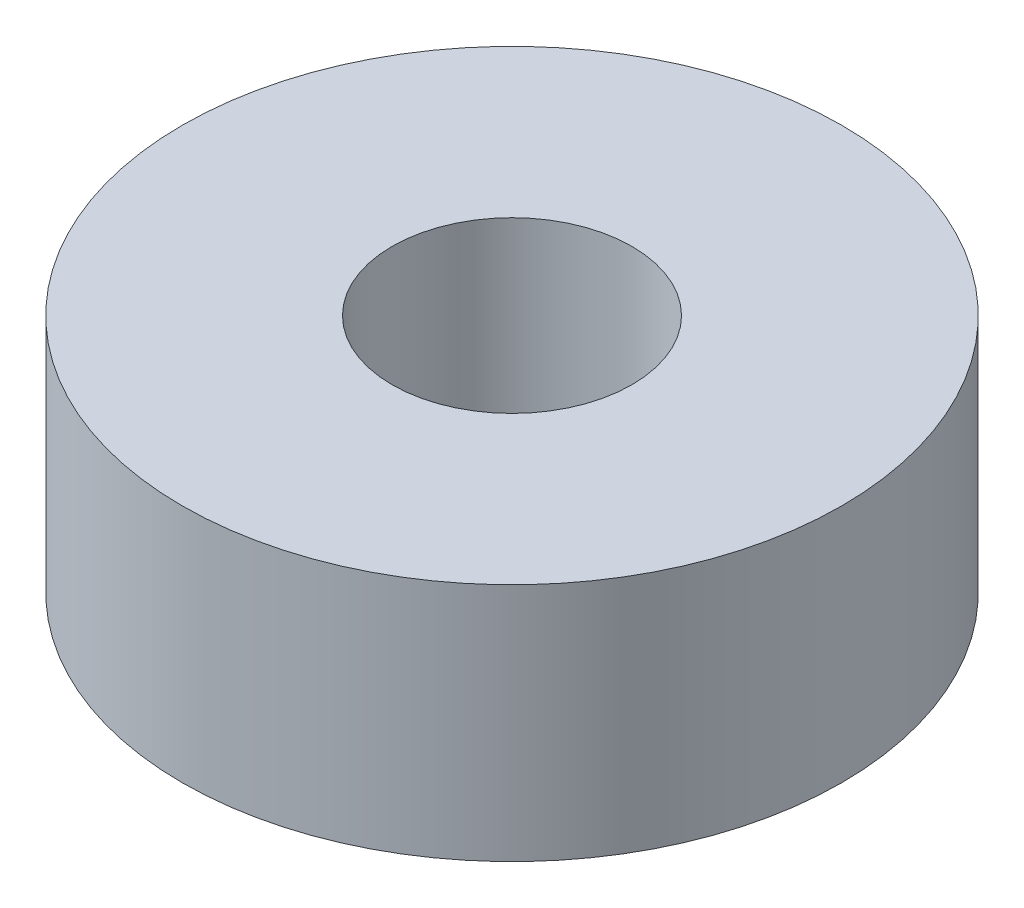
ISO-10303-21;
HEADER;
FILE_DESCRIPTION(('STEP AP214'),'2;1');
FILE_NAME('part.step','',(''),(''),'','','');
FILE_SCHEMA(('AUTOMOTIVE_DESIGN { 1 0 10303 214 1 1 1 1 }'));
ENDSEC;
DATA;
#1=APPLICATION_CONTEXT('core data for automotive mechanical design processes');
#2=APPLICATION_PROTOCOL_DEFINITION('international standard','automotive_design',2000,#1);
#3=PRODUCT_CONTEXT('',#1,'mechanical');
#4=PRODUCT('Part','Part','',(#3));
#5=PRODUCT_RELATED_PRODUCT_CATEGORY('part','',(#4));
#6=PRODUCT_DEFINITION_FORMATION('','',#4);
#7=PRODUCT_DEFINITION_CONTEXT('part definition',#1,'design');
#8=PRODUCT_DEFINITION('design','',#6,#7);
#9=PRODUCT_DEFINITION_SHAPE('','',#8);
#10=(LENGTH_UNIT() NAMED_UNIT(*) SI_UNIT(.MILLI.,.METRE.));
#11=(NAMED_UNIT(*) PLANE_ANGLE_UNIT() SI_UNIT($,.RADIAN.));
#12=(NAMED_UNIT(*) SI_UNIT($,.STERADIAN.) SOLID_ANGLE_UNIT());
#13=UNCERTAINTY_MEASURE_WITH_UNIT(LENGTH_MEASURE(1.E-05),#10,'distance_accuracy_value','');
#14=(GEOMETRIC_REPRESENTATION_CONTEXT(3) GLOBAL_UNCERTAINTY_ASSIGNED_CONTEXT((#13)) GLOBAL_UNIT_ASSIGNED_CONTEXT((#10,
#11,#12)) REPRESENTATION_CONTEXT('',''));
#15=CARTESIAN_POINT('',(0.,0.,0.));
#16=DIRECTION('',(0.,0.,1.));
#17=DIRECTION('',(1.,0.,0.));
#18=AXIS2_PLACEMENT_3D('',#15,#16,#17);
#19=CARTESIAN_POINT('',(0.,8.,0.));
#20=DIRECTION('',(0.,1.,0.));
#21=DIRECTION('',(0.,0.,1.));
#22=AXIS2_PLACEMENT_3D('',#19,#20,#21);
#23=PLANE('',#22);
#24=CARTESIAN_POINT('',(0.,8.,0.));
#25=DIRECTION('',(0.,1.,0.));
#26=DIRECTION('',(0.,0.,1.));
#27=AXIS2_PLACEMENT_3D('',#24,#25,#26);
#28=CIRCLE('',#27,11.);
#29=CARTESIAN_POINT('',(0.,8.,11.));
#30=VERTEX_POINT('',#29);
#31=EDGE_CURVE('E10',#30,#30,#28,.T.);
#32=ORIENTED_EDGE('',*,*,#31,.T.);
#33=EDGE_LOOP('',(#32));
#34=FACE_BOUND('',#33,.T.);
#35=CARTESIAN_POINT('',(0.,8.,0.));
#36=DIRECTION('',(0.,1.,0.));
#37=DIRECTION('',(0.,0.,1.));
#38=AXIS2_PLACEMENT_3D('',#35,#36,#37);
#39=CIRCLE('',#38,4.);
#40=CARTESIAN_POINT('',(0.,8.,4.));
#41=VERTEX_POINT('',#40);
#42=EDGE_CURVE('E43',#41,#41,#39,.T.);
#43=ORIENTED_EDGE('',*,*,#42,.F.);
#44=EDGE_LOOP('',(#43));
#45=FACE_BOUND('',#44,.T.);
#46=ADVANCED_FACE('F32',(#34,#45),#23,.T.);
#47=CARTESIAN_POINT('',(0.,0.,0.));
#48=DIRECTION('',(0.,1.,0.));
#49=DIRECTION('',(0.,0.,1.));
#50=AXIS2_PLACEMENT_3D('',#47,#48,#49);
#51=PLANE('',#50);
#52=CARTESIAN_POINT('',(0.,0.,0.));
#53=DIRECTION('',(0.,1.,0.));
#54=DIRECTION('',(0.,0.,1.));
#55=AXIS2_PLACEMENT_3D('',#52,#53,#54);
#56=CIRCLE('',#55,11.);
#57=CARTESIAN_POINT('',(0.,0.,11.));
#58=VERTEX_POINT('',#57);
#59=EDGE_CURVE('E36',#58,#58,#56,.T.);
#60=ORIENTED_EDGE('',*,*,#59,.F.);
#61=EDGE_LOOP('',(#60));
#62=FACE_BOUND('',#61,.T.);
#63=CARTESIAN_POINT('',(0.,0.,0.));
#64=DIRECTION('',(0.,1.,0.));
#65=DIRECTION('',(0.,0.,1.));
#66=AXIS2_PLACEMENT_3D('',#63,#64,#65);
#67=CIRCLE('',#66,4.);
#68=CARTESIAN_POINT('',(0.,0.,4.));
#69=VERTEX_POINT('',#68);
#70=EDGE_CURVE('E45',#69,#69,#67,.T.);
#71=ORIENTED_EDGE('',*,*,#70,.T.);
#72=EDGE_LOOP('',(#71));
#73=FACE_BOUND('',#72,.T.);
#74=ADVANCED_FACE('F55',(#62,#73),#51,.F.);
#75=CARTESIAN_POINT('',(0.,8.,0.));
#76=DIRECTION('',(0.,-1.,0.));
#77=DIRECTION('',(0.,0.,-1.));
#78=AXIS2_PLACEMENT_3D('',#75,#76,#77);
#79=CYLINDRICAL_SURFACE('',#78,11.);
#80=ORIENTED_EDGE('',*,*,#31,.F.);
#81=EDGE_LOOP('',(#80));
#82=FACE_BOUND('',#81,.T.);
#83=ORIENTED_EDGE('',*,*,#59,.T.);
#84=EDGE_LOOP('',(#83));
#85=FACE_BOUND('',#84,.T.);
#86=ADVANCED_FACE('F34',(#82,#85),#79,.T.);
#87=CARTESIAN_POINT('',(0.,8.,0.));
#88=DIRECTION('',(0.,-1.,0.));
#89=DIRECTION('',(0.,0.,-1.));
#90=AXIS2_PLACEMENT_3D('',#87,#88,#89);
#91=CYLINDRICAL_SURFACE('',#90,4.);
#92=ORIENTED_EDGE('',*,*,#42,.T.);
#93=EDGE_LOOP('',(#92));
#94=FACE_BOUND('',#93,.T.);
#95=ORIENTED_EDGE('',*,*,#70,.F.);
#96=EDGE_LOOP('',(#95));
#97=FACE_BOUND('',#96,.T.);
#98=ADVANCED_FACE('F51',(#94,#97),#91,.F.);
#99=CLOSED_SHELL('',(#46,#74,#86,#98));
#100=MANIFOLD_SOLID_BREP('B2',#99);
#101=ADVANCED_BREP_SHAPE_REPRESENTATION('',(#18,#100),#14);
#102=SHAPE_DEFINITION_REPRESENTATION(#9,#101);
ENDSEC;
END-ISO-10303-21;
